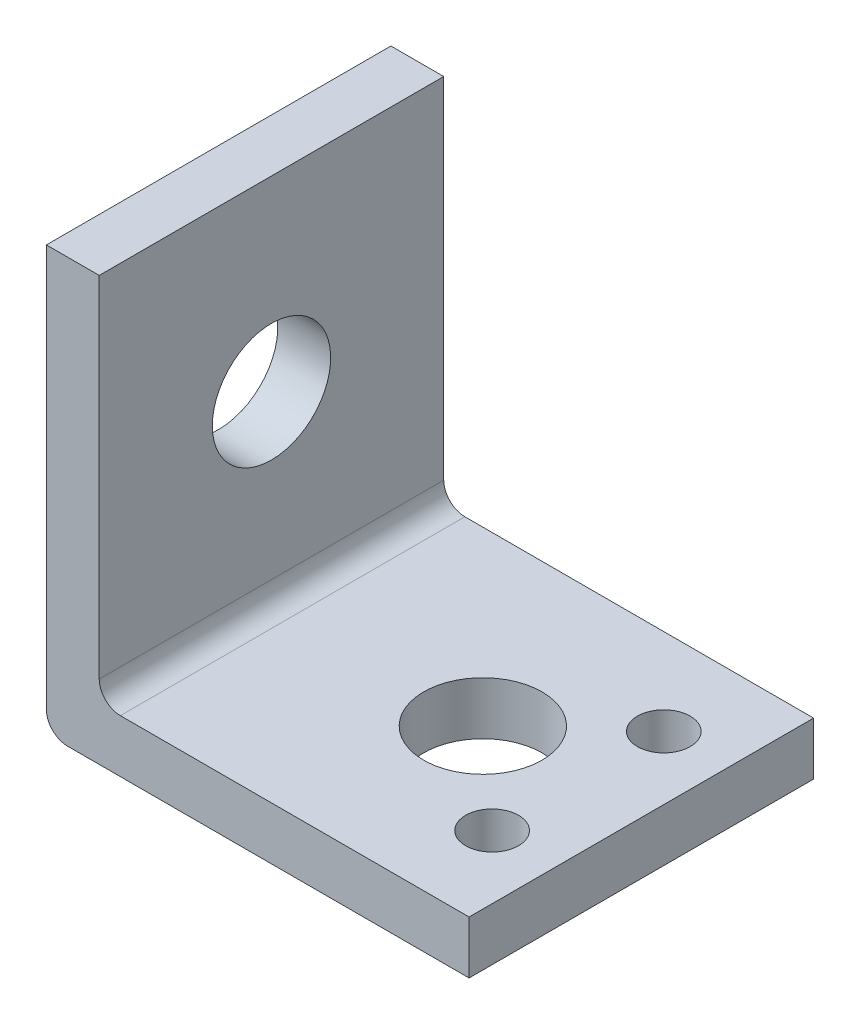
ISO-10303-21;
HEADER;
FILE_DESCRIPTION(('STEP AP214'),'2;1');
FILE_NAME('part.step','',(''),(''),'','','');
FILE_SCHEMA(('AUTOMOTIVE_DESIGN { 1 0 10303 214 1 1 1 1 }'));
ENDSEC;
DATA;
#1=APPLICATION_CONTEXT('core data for automotive mechanical design processes');
#2=APPLICATION_PROTOCOL_DEFINITION('international standard','automotive_design',2000,#1);
#3=PRODUCT_CONTEXT('',#1,'mechanical');
#4=PRODUCT('Part','Part','',(#3));
#5=PRODUCT_RELATED_PRODUCT_CATEGORY('part','',(#4));
#6=PRODUCT_DEFINITION_FORMATION('','',#4);
#7=PRODUCT_DEFINITION_CONTEXT('part definition',#1,'design');
#8=PRODUCT_DEFINITION('design','',#6,#7);
#9=PRODUCT_DEFINITION_SHAPE('','',#8);
#10=(LENGTH_UNIT() NAMED_UNIT(*) SI_UNIT(.MILLI.,.METRE.));
#11=(NAMED_UNIT(*) PLANE_ANGLE_UNIT() SI_UNIT($,.RADIAN.));
#12=(NAMED_UNIT(*) SI_UNIT($,.STERADIAN.) SOLID_ANGLE_UNIT());
#13=UNCERTAINTY_MEASURE_WITH_UNIT(LENGTH_MEASURE(1.E-05),#10,'distance_accuracy_value','');
#14=(GEOMETRIC_REPRESENTATION_CONTEXT(3) GLOBAL_UNCERTAINTY_ASSIGNED_CONTEXT((#13)) GLOBAL_UNIT_ASSIGNED_CONTEXT((#10,
#11,#12)) REPRESENTATION_CONTEXT('',''));
#15=CARTESIAN_POINT('',(0.,0.,0.));
#16=DIRECTION('',(0.,0.,1.));
#17=DIRECTION('',(1.,0.,0.));
#18=AXIS2_PLACEMENT_3D('',#15,#16,#17);
#19=CARTESIAN_POINT('',(50.8,0.,41.402));
#20=DIRECTION('',(-1.,0.,0.));
#21=DIRECTION('',(0.,0.,1.));
#22=AXIS2_PLACEMENT_3D('',#19,#20,#21);
#23=PLANE('',#22);
#24=DIRECTION('',(0.,1.,0.));
#25=VECTOR('',#24,1.);
#26=CARTESIAN_POINT('',(50.8,0.,0.));
#27=LINE('',#26,#25);
#28=CARTESIAN_POINT('',(50.8,0.,0.));
#29=VERTEX_POINT('',#28);
#30=CARTESIAN_POINT('',(50.8,6.35,0.));
#31=VERTEX_POINT('',#30);
#32=EDGE_CURVE('E130',#29,#31,#27,.T.);
#33=ORIENTED_EDGE('',*,*,#32,.T.);
#34=DIRECTION('',(0.,0.,-1.));
#35=VECTOR('',#34,1.);
#36=CARTESIAN_POINT('',(50.8,6.35,41.402));
#37=LINE('',#36,#35);
#38=CARTESIAN_POINT('',(50.8,6.35,41.402));
#39=VERTEX_POINT('',#38);
#40=EDGE_CURVE('E11',#39,#31,#37,.T.);
#41=ORIENTED_EDGE('',*,*,#40,.F.);
#42=DIRECTION('',(0.,1.,0.));
#43=VECTOR('',#42,1.);
#44=CARTESIAN_POINT('',(50.8,0.,41.402));
#45=LINE('',#44,#43);
#46=CARTESIAN_POINT('',(50.8,0.,41.402));
#47=VERTEX_POINT('',#46);
#48=EDGE_CURVE('E145',#47,#39,#45,.T.);
#49=ORIENTED_EDGE('',*,*,#48,.F.);
#50=DIRECTION('',(0.,0.,-1.));
#51=VECTOR('',#50,1.);
#52=CARTESIAN_POINT('',(50.8,0.,41.402));
#53=LINE('',#52,#51);
#54=EDGE_CURVE('E126',#47,#29,#53,.T.);
#55=ORIENTED_EDGE('',*,*,#54,.T.);
#56=EDGE_LOOP('',(#33,#41,#49,#55));
#57=FACE_BOUND('',#56,.T.);
#58=ADVANCED_FACE('F34',(#57),#23,.F.);
#59=CARTESIAN_POINT('',(50.8,6.35,41.402));
#60=DIRECTION('',(0.,-1.,0.));
#61=DIRECTION('',(1.,0.,0.));
#62=AXIS2_PLACEMENT_3D('',#59,#60,#61);
#63=PLANE('',#62);
#64=CARTESIAN_POINT('',(43.18,6.35,31.01975));
#65=DIRECTION('',(0.,-1.,0.));
#66=DIRECTION('',(1.,0.,0.));
#67=AXIS2_PLACEMENT_3D('',#64,#65,#66);
#68=CIRCLE('',#67,3.175);
#69=CARTESIAN_POINT('',(43.18,6.35000000000001,27.84475));
#70=VERTEX_POINT('',#69);
#71=EDGE_CURVE('E195',#70,#70,#68,.T.);
#72=ORIENTED_EDGE('',*,*,#71,.T.);
#73=EDGE_LOOP('',(#72));
#74=FACE_BOUND('',#73,.T.);
#75=CARTESIAN_POINT('',(43.18,6.35,10.38225));
#76=DIRECTION('',(0.,-1.,0.));
#77=DIRECTION('',(1.,0.,0.));
#78=AXIS2_PLACEMENT_3D('',#75,#76,#77);
#79=CIRCLE('',#78,3.175);
#80=CARTESIAN_POINT('',(43.18,6.35000000000001,7.20725));
#81=VERTEX_POINT('',#80);
#82=EDGE_CURVE('E189',#81,#81,#79,.T.);
#83=ORIENTED_EDGE('',*,*,#82,.T.);
#84=EDGE_LOOP('',(#83));
#85=FACE_BOUND('',#84,.T.);
#86=CARTESIAN_POINT('',(31.75,6.35,20.701));
#87=DIRECTION('',(0.,-1.,0.));
#88=DIRECTION('',(1.,0.,0.));
#89=AXIS2_PLACEMENT_3D('',#86,#87,#88);
#90=CIRCLE('',#89,7.112);
#91=CARTESIAN_POINT('',(31.75,6.35000000000001,13.589));
#92=VERTEX_POINT('',#91);
#93=EDGE_CURVE('E183',#92,#92,#90,.T.);
#94=ORIENTED_EDGE('',*,*,#93,.T.);
#95=EDGE_LOOP('',(#94));
#96=FACE_BOUND('',#95,.T.);
#97=DIRECTION('',(-1.,0.,0.));
#98=VECTOR('',#97,1.);
#99=CARTESIAN_POINT('',(50.8,6.35,0.));
#100=LINE('',#99,#98);
#101=CARTESIAN_POINT('',(8.89000000000002,6.35,0.));
#102=VERTEX_POINT('',#101);
#103=EDGE_CURVE('E133',#31,#102,#100,.T.);
#104=ORIENTED_EDGE('',*,*,#103,.T.);
#105=DIRECTION('',(0.,0.,-1.));
#106=VECTOR('',#105,1.);
#107=CARTESIAN_POINT('',(8.89000000000002,6.35,41.402));
#108=LINE('',#107,#106);
#109=CARTESIAN_POINT('',(8.89000000000002,6.35,41.402));
#110=VERTEX_POINT('',#109);
#111=EDGE_CURVE('E42',#110,#102,#108,.T.);
#112=ORIENTED_EDGE('',*,*,#111,.F.);
#113=DIRECTION('',(-1.,0.,0.));
#114=VECTOR('',#113,1.);
#115=CARTESIAN_POINT('',(50.8,6.35,41.402));
#116=LINE('',#115,#114);
#117=EDGE_CURVE('E93',#39,#110,#116,.T.);
#118=ORIENTED_EDGE('',*,*,#117,.F.);
#119=ORIENTED_EDGE('',*,*,#40,.T.);
#120=EDGE_LOOP('',(#104,#112,#118,#119));
#121=FACE_BOUND('',#120,.T.);
#122=ADVANCED_FACE('F221',(#74,#85,#96,#121),#63,.F.);
#123=CARTESIAN_POINT('',(8.89,8.89,41.402));
#124=DIRECTION('',(0.,0.,-1.));
#125=DIRECTION('',(-1.,0.,0.));
#126=AXIS2_PLACEMENT_3D('',#123,#124,#125);
#127=CYLINDRICAL_SURFACE('',#126,2.54);
#128=CARTESIAN_POINT('',(8.89,8.89,0.));
#129=DIRECTION('',(0.,0.,-1.));
#130=DIRECTION('',(1.,0.,0.));
#131=AXIS2_PLACEMENT_3D('',#128,#129,#130);
#132=CIRCLE('',#131,2.54);
#133=CARTESIAN_POINT('',(6.35,8.89000000000002,0.));
#134=VERTEX_POINT('',#133);
#135=EDGE_CURVE('E136',#102,#134,#132,.T.);
#136=ORIENTED_EDGE('',*,*,#135,.T.);
#137=DIRECTION('',(0.,0.,-1.));
#138=VECTOR('',#137,1.);
#139=CARTESIAN_POINT('',(6.35,8.89000000000002,41.402));
#140=LINE('',#139,#138);
#141=CARTESIAN_POINT('',(6.35,8.89000000000002,41.402));
#142=VERTEX_POINT('',#141);
#143=EDGE_CURVE('E152',#142,#134,#140,.T.);
#144=ORIENTED_EDGE('',*,*,#143,.F.);
#145=CARTESIAN_POINT('',(8.89,8.89,41.402));
#146=DIRECTION('',(0.,0.,-1.));
#147=DIRECTION('',(1.,0.,0.));
#148=AXIS2_PLACEMENT_3D('',#145,#146,#147);
#149=CIRCLE('',#148,2.54);
#150=EDGE_CURVE('E160',#110,#142,#149,.T.);
#151=ORIENTED_EDGE('',*,*,#150,.F.);
#152=ORIENTED_EDGE('',*,*,#111,.T.);
#153=EDGE_LOOP('',(#136,#144,#151,#152));
#154=FACE_BOUND('',#153,.T.);
#155=ADVANCED_FACE('F158',(#154),#127,.F.);
#156=CARTESIAN_POINT('',(6.35,50.9009802819273,41.402));
#157=DIRECTION('',(-1.,0.,0.));
#158=DIRECTION('',(0.,-1.,0.));
#159=AXIS2_PLACEMENT_3D('',#156,#157,#158);
#160=PLANE('',#159);
#161=CARTESIAN_POINT('',(6.35,28.448,20.701));
#162=DIRECTION('',(-1.,0.,0.));
#163=DIRECTION('',(0.,-1.,0.));
#164=AXIS2_PLACEMENT_3D('',#161,#162,#163);
#165=CIRCLE('',#164,7.112);
#166=CARTESIAN_POINT('',(6.35,21.336,20.701));
#167=VERTEX_POINT('',#166);
#168=EDGE_CURVE('E134',#167,#167,#165,.T.);
#169=ORIENTED_EDGE('',*,*,#168,.T.);
#170=EDGE_LOOP('',(#169));
#171=FACE_BOUND('',#170,.T.);
#172=DIRECTION('',(0.,1.,0.));
#173=VECTOR('',#172,1.);
#174=CARTESIAN_POINT('',(6.35,50.9009802819273,0.));
#175=LINE('',#174,#173);
#176=CARTESIAN_POINT('',(6.35,50.9009802819273,0.));
#177=VERTEX_POINT('',#176);
#178=EDGE_CURVE('E138',#134,#177,#175,.T.);
#179=ORIENTED_EDGE('',*,*,#178,.T.);
#180=DIRECTION('',(0.,0.,-1.));
#181=VECTOR('',#180,1.);
#182=CARTESIAN_POINT('',(6.35,50.9009802819273,41.402));
#183=LINE('',#182,#181);
#184=CARTESIAN_POINT('',(6.35,50.9009802819273,41.402));
#185=VERTEX_POINT('',#184);
#186=EDGE_CURVE('E149',#185,#177,#183,.T.);
#187=ORIENTED_EDGE('',*,*,#186,.F.);
#188=DIRECTION('',(0.,1.,0.));
#189=VECTOR('',#188,1.);
#190=CARTESIAN_POINT('',(6.35,50.9009802819273,41.402));
#191=LINE('',#190,#189);
#192=EDGE_CURVE('E172',#142,#185,#191,.T.);
#193=ORIENTED_EDGE('',*,*,#192,.F.);
#194=ORIENTED_EDGE('',*,*,#143,.T.);
#195=EDGE_LOOP('',(#179,#187,#193,#194));
#196=FACE_BOUND('',#195,.T.);
#197=ADVANCED_FACE('F168',(#171,#196),#160,.F.);
#198=CARTESIAN_POINT('',(0.,50.9009802819273,41.402));
#199=DIRECTION('',(0.,-1.,0.));
#200=DIRECTION('',(0.,0.,-1.));
#201=AXIS2_PLACEMENT_3D('',#198,#199,#200);
#202=PLANE('',#201);
#203=DIRECTION('',(-1.,0.,0.));
#204=VECTOR('',#203,1.);
#205=CARTESIAN_POINT('',(0.,50.9009802819273,0.));
#206=LINE('',#205,#204);
#207=CARTESIAN_POINT('',(0.,50.9009802819273,0.));
#208=VERTEX_POINT('',#207);
#209=EDGE_CURVE('E140',#177,#208,#206,.T.);
#210=ORIENTED_EDGE('',*,*,#209,.T.);
#211=DIRECTION('',(0.,0.,-1.));
#212=VECTOR('',#211,1.);
#213=CARTESIAN_POINT('',(0.,50.9009802819273,41.402));
#214=LINE('',#213,#212);
#215=CARTESIAN_POINT('',(0.,50.9009802819273,41.402));
#216=VERTEX_POINT('',#215);
#217=EDGE_CURVE('E121',#216,#208,#214,.T.);
#218=ORIENTED_EDGE('',*,*,#217,.F.);
#219=DIRECTION('',(-1.,0.,0.));
#220=VECTOR('',#219,1.);
#221=CARTESIAN_POINT('',(0.,50.9009802819273,41.402));
#222=LINE('',#221,#220);
#223=EDGE_CURVE('E112',#185,#216,#222,.T.);
#224=ORIENTED_EDGE('',*,*,#223,.F.);
#225=ORIENTED_EDGE('',*,*,#186,.T.);
#226=EDGE_LOOP('',(#210,#218,#224,#225));
#227=FACE_BOUND('',#226,.T.);
#228=ADVANCED_FACE('F171',(#227),#202,.F.);
#229=CARTESIAN_POINT('',(0.,2.54000000000002,41.402));
#230=DIRECTION('',(1.,0.,0.));
#231=DIRECTION('',(0.,0.,-1.));
#232=AXIS2_PLACEMENT_3D('',#229,#230,#231);
#233=PLANE('',#232);
#234=CARTESIAN_POINT('',(0.,28.448,20.701));
#235=DIRECTION('',(-1.,0.,0.));
#236=DIRECTION('',(0.,0.,1.));
#237=AXIS2_PLACEMENT_3D('',#234,#235,#236);
#238=CIRCLE('',#237,7.112);
#239=CARTESIAN_POINT('',(0.,28.448,27.813));
#240=VERTEX_POINT('',#239);
#241=EDGE_CURVE('E180',#240,#240,#238,.T.);
#242=ORIENTED_EDGE('',*,*,#241,.F.);
#243=EDGE_LOOP('',(#242));
#244=FACE_BOUND('',#243,.T.);
#245=DIRECTION('',(0.,-1.,0.));
#246=VECTOR('',#245,1.);
#247=CARTESIAN_POINT('',(0.,2.54000000000002,0.));
#248=LINE('',#247,#246);
#249=CARTESIAN_POINT('',(0.,2.54000000000002,0.));
#250=VERTEX_POINT('',#249);
#251=EDGE_CURVE('E120',#208,#250,#248,.T.);
#252=ORIENTED_EDGE('',*,*,#251,.T.);
#253=DIRECTION('',(0.,0.,-1.));
#254=VECTOR('',#253,1.);
#255=CARTESIAN_POINT('',(0.,2.54000000000002,41.402));
#256=LINE('',#255,#254);
#257=CARTESIAN_POINT('',(0.,2.54000000000002,41.402));
#258=VERTEX_POINT('',#257);
#259=EDGE_CURVE('E117',#258,#250,#256,.T.);
#260=ORIENTED_EDGE('',*,*,#259,.F.);
#261=DIRECTION('',(0.,-1.,0.));
#262=VECTOR('',#261,1.);
#263=CARTESIAN_POINT('',(0.,2.54000000000002,41.402));
#264=LINE('',#263,#262);
#265=EDGE_CURVE('E106',#216,#258,#264,.T.);
#266=ORIENTED_EDGE('',*,*,#265,.F.);
#267=ORIENTED_EDGE('',*,*,#217,.T.);
#268=EDGE_LOOP('',(#252,#260,#266,#267));
#269=FACE_BOUND('',#268,.T.);
#270=ADVANCED_FACE('F118',(#244,#269),#233,.F.);
#271=CARTESIAN_POINT('',(2.54,2.54,41.402));
#272=DIRECTION('',(0.,0.,-1.));
#273=DIRECTION('',(-1.,0.,0.));
#274=AXIS2_PLACEMENT_3D('',#271,#272,#273);
#275=CYLINDRICAL_SURFACE('',#274,2.54);
#276=CARTESIAN_POINT('',(2.54,2.54,0.));
#277=DIRECTION('',(0.,0.,1.));
#278=DIRECTION('',(1.,0.,0.));
#279=AXIS2_PLACEMENT_3D('',#276,#277,#278);
#280=CIRCLE('',#279,2.54);
#281=CARTESIAN_POINT('',(2.54000000000002,0.,0.));
#282=VERTEX_POINT('',#281);
#283=EDGE_CURVE('E79',#250,#282,#280,.T.);
#284=ORIENTED_EDGE('',*,*,#283,.T.);
#285=DIRECTION('',(0.,0.,-1.));
#286=VECTOR('',#285,1.);
#287=CARTESIAN_POINT('',(2.54000000000002,0.,41.402));
#288=LINE('',#287,#286);
#289=CARTESIAN_POINT('',(2.54000000000002,0.,41.402));
#290=VERTEX_POINT('',#289);
#291=EDGE_CURVE('E122',#290,#282,#288,.T.);
#292=ORIENTED_EDGE('',*,*,#291,.F.);
#293=CARTESIAN_POINT('',(2.54,2.54,41.402));
#294=DIRECTION('',(0.,0.,1.));
#295=DIRECTION('',(1.,0.,0.));
#296=AXIS2_PLACEMENT_3D('',#293,#294,#295);
#297=CIRCLE('',#296,2.54);
#298=EDGE_CURVE('E110',#258,#290,#297,.T.);
#299=ORIENTED_EDGE('',*,*,#298,.F.);
#300=ORIENTED_EDGE('',*,*,#259,.T.);
#301=EDGE_LOOP('',(#284,#292,#299,#300));
#302=FACE_BOUND('',#301,.T.);
#303=ADVANCED_FACE('F124',(#302),#275,.T.);
#304=CARTESIAN_POINT('',(2.54000000000002,0.,41.402));
#305=DIRECTION('',(0.,1.,0.));
#306=DIRECTION('',(0.,0.,1.));
#307=AXIS2_PLACEMENT_3D('',#304,#305,#306);
#308=PLANE('',#307);
#309=CARTESIAN_POINT('',(43.18,0.,31.01975));
#310=DIRECTION('',(0.,-1.,0.));
#311=DIRECTION('',(0.,0.,1.));
#312=AXIS2_PLACEMENT_3D('',#309,#310,#311);
#313=CIRCLE('',#312,3.175);
#314=CARTESIAN_POINT('',(43.18,0.,27.84475));
#315=VERTEX_POINT('',#314);
#316=EDGE_CURVE('E198',#315,#315,#313,.T.);
#317=ORIENTED_EDGE('',*,*,#316,.F.);
#318=EDGE_LOOP('',(#317));
#319=FACE_BOUND('',#318,.T.);
#320=CARTESIAN_POINT('',(43.18,0.,10.38225));
#321=DIRECTION('',(0.,-1.,0.));
#322=DIRECTION('',(0.,0.,-1.));
#323=AXIS2_PLACEMENT_3D('',#320,#321,#322);
#324=CIRCLE('',#323,3.175);
#325=CARTESIAN_POINT('',(43.18,0.,7.20725));
#326=VERTEX_POINT('',#325);
#327=EDGE_CURVE('E192',#326,#326,#324,.T.);
#328=ORIENTED_EDGE('',*,*,#327,.F.);
#329=EDGE_LOOP('',(#328));
#330=FACE_BOUND('',#329,.T.);
#331=CARTESIAN_POINT('',(31.75,0.,20.701));
#332=DIRECTION('',(0.,-1.,0.));
#333=DIRECTION('',(0.,0.,-1.));
#334=AXIS2_PLACEMENT_3D('',#331,#332,#333);
#335=CIRCLE('',#334,7.112);
#336=CARTESIAN_POINT('',(31.75,0.,13.589));
#337=VERTEX_POINT('',#336);
#338=EDGE_CURVE('E186',#337,#337,#335,.T.);
#339=ORIENTED_EDGE('',*,*,#338,.F.);
#340=EDGE_LOOP('',(#339));
#341=FACE_BOUND('',#340,.T.);
#342=DIRECTION('',(1.,0.,0.));
#343=VECTOR('',#342,1.);
#344=CARTESIAN_POINT('',(2.54000000000002,0.,0.));
#345=LINE('',#344,#343);
#346=EDGE_CURVE('E85',#282,#29,#345,.T.);
#347=ORIENTED_EDGE('',*,*,#346,.T.);
#348=ORIENTED_EDGE('',*,*,#54,.F.);
#349=DIRECTION('',(1.,0.,0.));
#350=VECTOR('',#349,1.);
#351=CARTESIAN_POINT('',(2.54000000000002,0.,41.402));
#352=LINE('',#351,#350);
#353=EDGE_CURVE('E50',#290,#47,#352,.T.);
#354=ORIENTED_EDGE('',*,*,#353,.F.);
#355=ORIENTED_EDGE('',*,*,#291,.T.);
#356=EDGE_LOOP('',(#347,#348,#354,#355));
#357=FACE_BOUND('',#356,.T.);
#358=ADVANCED_FACE('F205',(#319,#330,#341,#357),#308,.F.);
#359=CARTESIAN_POINT('',(8.89,8.89,41.402));
#360=DIRECTION('',(0.,0.,1.));
#361=DIRECTION('',(1.,0.,0.));
#362=AXIS2_PLACEMENT_3D('',#359,#360,#361);
#363=PLANE('',#362);
#364=ORIENTED_EDGE('',*,*,#48,.T.);
#365=ORIENTED_EDGE('',*,*,#117,.T.);
#366=ORIENTED_EDGE('',*,*,#150,.T.);
#367=ORIENTED_EDGE('',*,*,#192,.T.);
#368=ORIENTED_EDGE('',*,*,#223,.T.);
#369=ORIENTED_EDGE('',*,*,#265,.T.);
#370=ORIENTED_EDGE('',*,*,#298,.T.);
#371=ORIENTED_EDGE('',*,*,#353,.T.);
#372=EDGE_LOOP('',(#364,#365,#366,#367,#368,#369,#370,#371));
#373=FACE_BOUND('',#372,.T.);
#374=ADVANCED_FACE('F108',(#373),#363,.T.);
#375=CARTESIAN_POINT('',(8.89,8.89,0.));
#376=DIRECTION('',(0.,0.,1.));
#377=DIRECTION('',(1.,0.,0.));
#378=AXIS2_PLACEMENT_3D('',#375,#376,#377);
#379=PLANE('',#378);
#380=ORIENTED_EDGE('',*,*,#32,.F.);
#381=ORIENTED_EDGE('',*,*,#346,.F.);
#382=ORIENTED_EDGE('',*,*,#283,.F.);
#383=ORIENTED_EDGE('',*,*,#251,.F.);
#384=ORIENTED_EDGE('',*,*,#209,.F.);
#385=ORIENTED_EDGE('',*,*,#178,.F.);
#386=ORIENTED_EDGE('',*,*,#135,.F.);
#387=ORIENTED_EDGE('',*,*,#103,.F.);
#388=EDGE_LOOP('',(#380,#381,#382,#383,#384,#385,#386,#387));
#389=FACE_BOUND('',#388,.T.);
#390=ADVANCED_FACE('F164',(#389),#379,.F.);
#391=CARTESIAN_POINT('',(50.8,28.448,20.701));
#392=DIRECTION('',(-1.,0.,0.));
#393=DIRECTION('',(0.,0.,1.));
#394=AXIS2_PLACEMENT_3D('',#391,#392,#393);
#395=CYLINDRICAL_SURFACE('',#394,7.112);
#396=ORIENTED_EDGE('',*,*,#241,.T.);
#397=EDGE_LOOP('',(#396));
#398=FACE_BOUND('',#397,.T.);
#399=ORIENTED_EDGE('',*,*,#168,.F.);
#400=EDGE_LOOP('',(#399));
#401=FACE_BOUND('',#400,.T.);
#402=ADVANCED_FACE('F217',(#398,#401),#395,.F.);
#403=CARTESIAN_POINT('',(31.75,50.9009802819273,20.701));
#404=DIRECTION('',(0.,-1.,0.));
#405=DIRECTION('',(0.,0.,-1.));
#406=AXIS2_PLACEMENT_3D('',#403,#404,#405);
#407=CYLINDRICAL_SURFACE('',#406,7.112);
#408=CARTESIAN_POINT('',(31.75,0.,13.589));
#409=CARTESIAN_POINT('',(31.75,0.0661458333333341,13.589));
#410=CARTESIAN_POINT('',(31.75,0.132291666666668,13.589));
#411=CARTESIAN_POINT('',(31.75,0.264583333333334,13.589));
#412=CARTESIAN_POINT('',(31.75,0.330729166666666,13.589));
#413=CARTESIAN_POINT('',(31.75,0.463020833333332,13.589));
#414=CARTESIAN_POINT('',(31.75,0.529166666666666,13.589));
#415=CARTESIAN_POINT('',(31.75,0.661458333333334,13.589));
#416=CARTESIAN_POINT('',(31.75,0.727604166666669,13.589));
#417=CARTESIAN_POINT('',(31.75,0.859895833333335,13.589));
#418=CARTESIAN_POINT('',(31.75,0.926041666666666,13.589));
#419=CARTESIAN_POINT('',(31.75,1.05833333333333,13.589));
#420=CARTESIAN_POINT('',(31.75,1.12447916666667,13.589));
#421=CARTESIAN_POINT('',(31.75,1.25677083333333,13.589));
#422=CARTESIAN_POINT('',(31.75,1.32291666666667,13.589));
#423=CARTESIAN_POINT('',(31.75,1.45520833333334,13.589));
#424=CARTESIAN_POINT('',(31.75,1.52135416666667,13.589));
#425=CARTESIAN_POINT('',(31.75,1.65364583333334,13.589));
#426=CARTESIAN_POINT('',(31.75,1.71979166666667,13.589));
#427=CARTESIAN_POINT('',(31.75,1.85208333333334,13.589));
#428=CARTESIAN_POINT('',(31.75,1.91822916666667,13.589));
#429=CARTESIAN_POINT('',(31.75,2.05052083333334,13.589));
#430=CARTESIAN_POINT('',(31.75,2.11666666666667,13.589));
#431=CARTESIAN_POINT('',(31.75,2.24895833333334,13.589));
#432=CARTESIAN_POINT('',(31.75,2.31510416666667,13.589));
#433=CARTESIAN_POINT('',(31.75,2.44739583333334,13.589));
#434=CARTESIAN_POINT('',(31.75,2.51354166666667,13.589));
#435=CARTESIAN_POINT('',(31.75,2.64583333333334,13.589));
#436=CARTESIAN_POINT('',(31.75,2.71197916666667,13.589));
#437=CARTESIAN_POINT('',(31.75,2.84427083333334,13.589));
#438=CARTESIAN_POINT('',(31.75,2.91041666666667,13.589));
#439=CARTESIAN_POINT('',(31.75,3.04270833333334,13.589));
#440=CARTESIAN_POINT('',(31.75,3.10885416666667,13.589));
#441=CARTESIAN_POINT('',(31.75,3.24114583333334,13.589));
#442=CARTESIAN_POINT('',(31.75,3.30729166666667,13.589));
#443=CARTESIAN_POINT('',(31.75,3.43958333333334,13.589));
#444=CARTESIAN_POINT('',(31.75,3.50572916666667,13.589));
#445=CARTESIAN_POINT('',(31.75,3.63802083333334,13.589));
#446=CARTESIAN_POINT('',(31.75,3.70416666666667,13.589));
#447=CARTESIAN_POINT('',(31.75,3.83645833333334,13.589));
#448=CARTESIAN_POINT('',(31.75,3.90260416666667,13.589));
#449=CARTESIAN_POINT('',(31.75,4.03489583333334,13.589));
#450=CARTESIAN_POINT('',(31.75,4.10104166666667,13.589));
#451=CARTESIAN_POINT('',(31.75,4.23333333333334,13.589));
#452=CARTESIAN_POINT('',(31.75,4.29947916666667,13.589));
#453=CARTESIAN_POINT('',(31.75,4.43177083333334,13.589));
#454=CARTESIAN_POINT('',(31.75,4.49791666666667,13.589));
#455=CARTESIAN_POINT('',(31.75,4.63020833333334,13.589));
#456=CARTESIAN_POINT('',(31.75,4.69635416666667,13.589));
#457=CARTESIAN_POINT('',(31.75,4.82864583333334,13.589));
#458=CARTESIAN_POINT('',(31.75,4.89479166666667,13.589));
#459=CARTESIAN_POINT('',(31.75,5.02708333333334,13.589));
#460=CARTESIAN_POINT('',(31.75,5.09322916666667,13.589));
#461=CARTESIAN_POINT('',(31.75,5.22552083333334,13.589));
#462=CARTESIAN_POINT('',(31.75,5.29166666666667,13.589));
#463=CARTESIAN_POINT('',(31.75,5.42395833333334,13.589));
#464=CARTESIAN_POINT('',(31.75,5.49010416666667,13.589));
#465=CARTESIAN_POINT('',(31.75,5.62239583333334,13.589));
#466=CARTESIAN_POINT('',(31.75,5.68854166666667,13.589));
#467=CARTESIAN_POINT('',(31.75,5.82083333333334,13.589));
#468=CARTESIAN_POINT('',(31.75,5.88697916666668,13.589));
#469=CARTESIAN_POINT('',(31.75,6.01927083333334,13.589));
#470=CARTESIAN_POINT('',(31.75,6.08541666666667,13.589));
#471=CARTESIAN_POINT('',(31.75,6.21770833333334,13.589));
#472=CARTESIAN_POINT('',(31.75,6.28385416666667,13.589));
#473=CARTESIAN_POINT('',(31.75,6.35000000000001,13.589));
#474=B_SPLINE_CURVE_WITH_KNOTS('',3,(#408,#409,#410,#411,#412,#413,#414,#415,#416,#417,#418,
#419,#420,#421,#422,#423,#424,#425,#426,#427,#428,#429,#430,#431,#432,#433,#434,#435,#436,#437,
#438,#439,#440,#441,#442,#443,#444,#445,#446,#447,#448,#449,#450,#451,#452,#453,#454,#455,#456,
#457,#458,#459,#460,#461,#462,#463,#464,#465,#466,#467,#468,#469,#470,#471,#472,#473),
.UNSPECIFIED.,.F.,.F.,(4,2,2,2,2,2,2,2,2,2,2,2,2,2,2,2,2,2,2,2,2,2,2,2,2,2,2,2,2,2,2,2,4),(0.,
0.198437500000002,0.396874999999998,0.5953125,0.793750000000003,0.992187499999998,1.190625,
1.3890625,1.58750000000001,1.7859375,1.984375,2.18281250000001,2.38125,2.5796875,
2.77812500000001,2.9765625,3.175,3.37343750000001,3.571875,3.7703125,3.96875000000001,4.1671875,
4.365625,4.56406250000001,4.7625,4.96093750000001,5.15937500000001,5.3578125,5.55625000000001,
5.75468750000001,5.95312500000001,6.15156250000001,6.35000000000001),.UNSPECIFIED.);
#475=EDGE_CURVE('BSEAM213',#337,#92,#474,.T.);
#476=ORIENTED_EDGE('',*,*,#338,.T.);
#477=ORIENTED_EDGE('',*,*,#93,.F.);
#478=ORIENTED_EDGE('',*,*,#475,.T.);
#479=ORIENTED_EDGE('',*,*,#475,.F.);
#480=EDGE_LOOP('',(#476,#478,#477,#479));
#481=FACE_BOUND('',#480,.T.);
#482=ADVANCED_FACE('F213',(#481),#407,.F.);
#483=CARTESIAN_POINT('',(43.18,50.9009802819273,10.38225));
#484=DIRECTION('',(0.,-1.,0.));
#485=DIRECTION('',(0.,0.,-1.));
#486=AXIS2_PLACEMENT_3D('',#483,#484,#485);
#487=CYLINDRICAL_SURFACE('',#486,3.175);
#488=CARTESIAN_POINT('',(43.18,0.,7.20725));
#489=CARTESIAN_POINT('',(43.18,0.0661458333333341,7.20725));
#490=CARTESIAN_POINT('',(43.18,0.132291666666668,7.20725));
#491=CARTESIAN_POINT('',(43.18,0.264583333333334,7.20725));
#492=CARTESIAN_POINT('',(43.18,0.330729166666666,7.20725));
#493=CARTESIAN_POINT('',(43.18,0.463020833333332,7.20725));
#494=CARTESIAN_POINT('',(43.18,0.529166666666666,7.20725));
#495=CARTESIAN_POINT('',(43.18,0.661458333333334,7.20725));
#496=CARTESIAN_POINT('',(43.18,0.727604166666669,7.20725));
#497=CARTESIAN_POINT('',(43.18,0.859895833333335,7.20725));
#498=CARTESIAN_POINT('',(43.18,0.926041666666666,7.20725));
#499=CARTESIAN_POINT('',(43.18,1.05833333333333,7.20725));
#500=CARTESIAN_POINT('',(43.18,1.12447916666667,7.20725));
#501=CARTESIAN_POINT('',(43.18,1.25677083333333,7.20725));
#502=CARTESIAN_POINT('',(43.18,1.32291666666667,7.20725));
#503=CARTESIAN_POINT('',(43.18,1.45520833333334,7.20725));
#504=CARTESIAN_POINT('',(43.18,1.52135416666667,7.20725));
#505=CARTESIAN_POINT('',(43.18,1.65364583333334,7.20725));
#506=CARTESIAN_POINT('',(43.18,1.71979166666667,7.20725));
#507=CARTESIAN_POINT('',(43.18,1.85208333333334,7.20725));
#508=CARTESIAN_POINT('',(43.18,1.91822916666667,7.20725));
#509=CARTESIAN_POINT('',(43.18,2.05052083333334,7.20725));
#510=CARTESIAN_POINT('',(43.18,2.11666666666667,7.20725));
#511=CARTESIAN_POINT('',(43.18,2.24895833333334,7.20725));
#512=CARTESIAN_POINT('',(43.18,2.31510416666667,7.20725));
#513=CARTESIAN_POINT('',(43.18,2.44739583333334,7.20725));
#514=CARTESIAN_POINT('',(43.18,2.51354166666667,7.20725));
#515=CARTESIAN_POINT('',(43.18,2.64583333333334,7.20725));
#516=CARTESIAN_POINT('',(43.18,2.71197916666667,7.20725));
#517=CARTESIAN_POINT('',(43.18,2.84427083333334,7.20725));
#518=CARTESIAN_POINT('',(43.18,2.91041666666667,7.20725));
#519=CARTESIAN_POINT('',(43.18,3.04270833333334,7.20725));
#520=CARTESIAN_POINT('',(43.18,3.10885416666667,7.20725));
#521=CARTESIAN_POINT('',(43.18,3.24114583333334,7.20725));
#522=CARTESIAN_POINT('',(43.18,3.30729166666667,7.20725));
#523=CARTESIAN_POINT('',(43.18,3.43958333333334,7.20725));
#524=CARTESIAN_POINT('',(43.18,3.50572916666667,7.20725));
#525=CARTESIAN_POINT('',(43.18,3.63802083333334,7.20725));
#526=CARTESIAN_POINT('',(43.18,3.70416666666667,7.20725));
#527=CARTESIAN_POINT('',(43.18,3.83645833333334,7.20725));
#528=CARTESIAN_POINT('',(43.18,3.90260416666667,7.20725));
#529=CARTESIAN_POINT('',(43.18,4.03489583333334,7.20725));
#530=CARTESIAN_POINT('',(43.18,4.10104166666667,7.20725));
#531=CARTESIAN_POINT('',(43.18,4.23333333333334,7.20725));
#532=CARTESIAN_POINT('',(43.18,4.29947916666667,7.20725));
#533=CARTESIAN_POINT('',(43.18,4.43177083333334,7.20725));
#534=CARTESIAN_POINT('',(43.18,4.49791666666667,7.20725));
#535=CARTESIAN_POINT('',(43.18,4.63020833333334,7.20725));
#536=CARTESIAN_POINT('',(43.18,4.69635416666667,7.20725));
#537=CARTESIAN_POINT('',(43.18,4.82864583333334,7.20725));
#538=CARTESIAN_POINT('',(43.18,4.89479166666667,7.20725));
#539=CARTESIAN_POINT('',(43.18,5.02708333333334,7.20725));
#540=CARTESIAN_POINT('',(43.18,5.09322916666667,7.20725));
#541=CARTESIAN_POINT('',(43.18,5.22552083333334,7.20725));
#542=CARTESIAN_POINT('',(43.18,5.29166666666667,7.20725));
#543=CARTESIAN_POINT('',(43.18,5.42395833333334,7.20725));
#544=CARTESIAN_POINT('',(43.18,5.49010416666667,7.20725));
#545=CARTESIAN_POINT('',(43.18,5.62239583333334,7.20725));
#546=CARTESIAN_POINT('',(43.18,5.68854166666667,7.20725));
#547=CARTESIAN_POINT('',(43.18,5.82083333333334,7.20725));
#548=CARTESIAN_POINT('',(43.18,5.88697916666668,7.20725));
#549=CARTESIAN_POINT('',(43.18,6.01927083333334,7.20725));
#550=CARTESIAN_POINT('',(43.18,6.08541666666667,7.20725));
#551=CARTESIAN_POINT('',(43.18,6.21770833333334,7.20725));
#552=CARTESIAN_POINT('',(43.18,6.28385416666667,7.20725));
#553=CARTESIAN_POINT('',(43.18,6.35000000000001,7.20725));
#554=B_SPLINE_CURVE_WITH_KNOTS('',3,(#488,#489,#490,#491,#492,#493,#494,#495,#496,#497,#498,
#499,#500,#501,#502,#503,#504,#505,#506,#507,#508,#509,#510,#511,#512,#513,#514,#515,#516,#517,
#518,#519,#520,#521,#522,#523,#524,#525,#526,#527,#528,#529,#530,#531,#532,#533,#534,#535,#536,
#537,#538,#539,#540,#541,#542,#543,#544,#545,#546,#547,#548,#549,#550,#551,#552,#553),
.UNSPECIFIED.,.F.,.F.,(4,2,2,2,2,2,2,2,2,2,2,2,2,2,2,2,2,2,2,2,2,2,2,2,2,2,2,2,2,2,2,2,4),(0.,
0.198437500000002,0.396874999999998,0.5953125,0.793750000000003,0.992187499999998,1.190625,
1.3890625,1.58750000000001,1.7859375,1.984375,2.18281250000001,2.38125,2.5796875,
2.77812500000001,2.9765625,3.175,3.37343750000001,3.571875,3.7703125,3.96875000000001,4.1671875,
4.365625,4.56406250000001,4.7625,4.96093750000001,5.15937500000001,5.3578125,5.55625000000001,
5.75468750000001,5.95312500000001,6.15156250000001,6.35000000000001),.UNSPECIFIED.);
#555=EDGE_CURVE('BSEAM216',#326,#81,#554,.T.);
#556=ORIENTED_EDGE('',*,*,#327,.T.);
#557=ORIENTED_EDGE('',*,*,#82,.F.);
#558=ORIENTED_EDGE('',*,*,#555,.T.);
#559=ORIENTED_EDGE('',*,*,#555,.F.);
#560=EDGE_LOOP('',(#556,#558,#557,#559));
#561=FACE_BOUND('',#560,.T.);
#562=ADVANCED_FACE('F216',(#561),#487,.F.);
#563=CARTESIAN_POINT('',(43.18,50.9009802819273,31.01975));
#564=DIRECTION('',(0.,-1.,0.));
#565=DIRECTION('',(0.,0.,-1.));
#566=AXIS2_PLACEMENT_3D('',#563,#564,#565);
#567=CYLINDRICAL_SURFACE('',#566,3.175);
#568=CARTESIAN_POINT('',(43.18,0.,27.84475));
#569=CARTESIAN_POINT('',(43.18,0.0661458333333341,27.84475));
#570=CARTESIAN_POINT('',(43.18,0.132291666666668,27.84475));
#571=CARTESIAN_POINT('',(43.18,0.264583333333334,27.84475));
#572=CARTESIAN_POINT('',(43.18,0.330729166666666,27.84475));
#573=CARTESIAN_POINT('',(43.18,0.463020833333332,27.84475));
#574=CARTESIAN_POINT('',(43.18,0.529166666666666,27.84475));
#575=CARTESIAN_POINT('',(43.18,0.661458333333334,27.84475));
#576=CARTESIAN_POINT('',(43.18,0.727604166666669,27.84475));
#577=CARTESIAN_POINT('',(43.18,0.859895833333335,27.84475));
#578=CARTESIAN_POINT('',(43.18,0.926041666666666,27.84475));
#579=CARTESIAN_POINT('',(43.18,1.05833333333333,27.84475));
#580=CARTESIAN_POINT('',(43.18,1.12447916666667,27.84475));
#581=CARTESIAN_POINT('',(43.18,1.25677083333333,27.84475));
#582=CARTESIAN_POINT('',(43.18,1.32291666666667,27.84475));
#583=CARTESIAN_POINT('',(43.18,1.45520833333334,27.84475));
#584=CARTESIAN_POINT('',(43.18,1.52135416666667,27.84475));
#585=CARTESIAN_POINT('',(43.18,1.65364583333334,27.84475));
#586=CARTESIAN_POINT('',(43.18,1.71979166666667,27.84475));
#587=CARTESIAN_POINT('',(43.18,1.85208333333334,27.84475));
#588=CARTESIAN_POINT('',(43.18,1.91822916666667,27.84475));
#589=CARTESIAN_POINT('',(43.18,2.05052083333334,27.84475));
#590=CARTESIAN_POINT('',(43.18,2.11666666666667,27.84475));
#591=CARTESIAN_POINT('',(43.18,2.24895833333334,27.84475));
#592=CARTESIAN_POINT('',(43.18,2.31510416666667,27.84475));
#593=CARTESIAN_POINT('',(43.18,2.44739583333334,27.84475));
#594=CARTESIAN_POINT('',(43.18,2.51354166666667,27.84475));
#595=CARTESIAN_POINT('',(43.18,2.64583333333334,27.84475));
#596=CARTESIAN_POINT('',(43.18,2.71197916666667,27.84475));
#597=CARTESIAN_POINT('',(43.18,2.84427083333334,27.84475));
#598=CARTESIAN_POINT('',(43.18,2.91041666666667,27.84475));
#599=CARTESIAN_POINT('',(43.18,3.04270833333334,27.84475));
#600=CARTESIAN_POINT('',(43.18,3.10885416666667,27.84475));
#601=CARTESIAN_POINT('',(43.18,3.24114583333334,27.84475));
#602=CARTESIAN_POINT('',(43.18,3.30729166666667,27.84475));
#603=CARTESIAN_POINT('',(43.18,3.43958333333334,27.84475));
#604=CARTESIAN_POINT('',(43.18,3.50572916666667,27.84475));
#605=CARTESIAN_POINT('',(43.18,3.63802083333334,27.84475));
#606=CARTESIAN_POINT('',(43.18,3.70416666666667,27.84475));
#607=CARTESIAN_POINT('',(43.18,3.83645833333334,27.84475));
#608=CARTESIAN_POINT('',(43.18,3.90260416666667,27.84475));
#609=CARTESIAN_POINT('',(43.18,4.03489583333334,27.84475));
#610=CARTESIAN_POINT('',(43.18,4.10104166666667,27.84475));
#611=CARTESIAN_POINT('',(43.18,4.23333333333334,27.84475));
#612=CARTESIAN_POINT('',(43.18,4.29947916666667,27.84475));
#613=CARTESIAN_POINT('',(43.18,4.43177083333334,27.84475));
#614=CARTESIAN_POINT('',(43.18,4.49791666666667,27.84475));
#615=CARTESIAN_POINT('',(43.18,4.63020833333334,27.84475));
#616=CARTESIAN_POINT('',(43.18,4.69635416666667,27.84475));
#617=CARTESIAN_POINT('',(43.18,4.82864583333334,27.84475));
#618=CARTESIAN_POINT('',(43.18,4.89479166666667,27.84475));
#619=CARTESIAN_POINT('',(43.18,5.02708333333334,27.84475));
#620=CARTESIAN_POINT('',(43.18,5.09322916666667,27.84475));
#621=CARTESIAN_POINT('',(43.18,5.22552083333334,27.84475));
#622=CARTESIAN_POINT('',(43.18,5.29166666666667,27.84475));
#623=CARTESIAN_POINT('',(43.18,5.42395833333334,27.84475));
#624=CARTESIAN_POINT('',(43.18,5.49010416666667,27.84475));
#625=CARTESIAN_POINT('',(43.18,5.62239583333334,27.84475));
#626=CARTESIAN_POINT('',(43.18,5.68854166666667,27.84475));
#627=CARTESIAN_POINT('',(43.18,5.82083333333334,27.84475));
#628=CARTESIAN_POINT('',(43.18,5.88697916666668,27.84475));
#629=CARTESIAN_POINT('',(43.18,6.01927083333334,27.84475));
#630=CARTESIAN_POINT('',(43.18,6.08541666666667,27.84475));
#631=CARTESIAN_POINT('',(43.18,6.21770833333334,27.84475));
#632=CARTESIAN_POINT('',(43.18,6.28385416666667,27.84475));
#633=CARTESIAN_POINT('',(43.18,6.35000000000001,27.84475));
#634=B_SPLINE_CURVE_WITH_KNOTS('',3,(#568,#569,#570,#571,#572,#573,#574,#575,#576,#577,#578,
#579,#580,#581,#582,#583,#584,#585,#586,#587,#588,#589,#590,#591,#592,#593,#594,#595,#596,#597,
#598,#599,#600,#601,#602,#603,#604,#605,#606,#607,#608,#609,#610,#611,#612,#613,#614,#615,#616,
#617,#618,#619,#620,#621,#622,#623,#624,#625,#626,#627,#628,#629,#630,#631,#632,#633),
.UNSPECIFIED.,.F.,.F.,(4,2,2,2,2,2,2,2,2,2,2,2,2,2,2,2,2,2,2,2,2,2,2,2,2,2,2,2,2,2,2,2,4),(0.,
0.198437500000002,0.396874999999998,0.5953125,0.793750000000003,0.992187499999998,1.190625,
1.3890625,1.58750000000001,1.7859375,1.984375,2.18281250000001,2.38125,2.5796875,
2.77812500000001,2.9765625,3.175,3.37343750000001,3.571875,3.7703125,3.96875000000001,4.1671875,
4.365625,4.56406250000001,4.7625,4.96093750000001,5.15937500000001,5.3578125,5.55625000000001,
5.75468750000001,5.95312500000001,6.15156250000001,6.35000000000001),.UNSPECIFIED.);
#635=EDGE_CURVE('BSEAM202',#315,#70,#634,.T.);
#636=ORIENTED_EDGE('',*,*,#316,.T.);
#637=ORIENTED_EDGE('',*,*,#71,.F.);
#638=ORIENTED_EDGE('',*,*,#635,.T.);
#639=ORIENTED_EDGE('',*,*,#635,.F.);
#640=EDGE_LOOP('',(#636,#638,#637,#639));
#641=FACE_BOUND('',#640,.T.);
#642=ADVANCED_FACE('F202',(#641),#567,.F.);
#643=CLOSED_SHELL('',(#58,#122,#155,#197,#228,#270,#303,#358,#374,#390,#402,#482,#562,#642));
#644=MANIFOLD_SOLID_BREP('B2',#643);
#645=ADVANCED_BREP_SHAPE_REPRESENTATION('',(#18,#644),#14);
#646=SHAPE_DEFINITION_REPRESENTATION(#9,#645);
ENDSEC;
END-ISO-10303-21;
